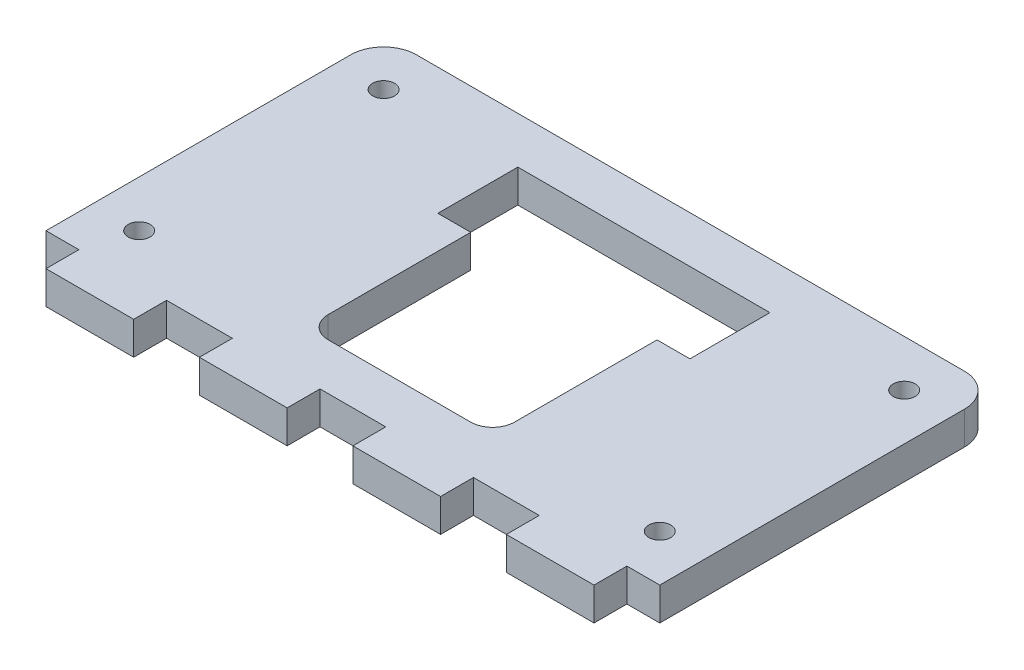
ISO-10303-21;
HEADER;
FILE_DESCRIPTION(('STEP AP214'),'2;1');
FILE_NAME('part.step','',(''),(''),'','','');
FILE_SCHEMA(('AUTOMOTIVE_DESIGN { 1 0 10303 214 1 1 1 1 }'));
ENDSEC;
DATA;
#1=APPLICATION_CONTEXT('core data for automotive mechanical design processes');
#2=APPLICATION_PROTOCOL_DEFINITION('international standard','automotive_design',2000,#1);
#3=PRODUCT_CONTEXT('',#1,'mechanical');
#4=PRODUCT('Part','Part','',(#3));
#5=PRODUCT_RELATED_PRODUCT_CATEGORY('part','',(#4));
#6=PRODUCT_DEFINITION_FORMATION('','',#4);
#7=PRODUCT_DEFINITION_CONTEXT('part definition',#1,'design');
#8=PRODUCT_DEFINITION('design','',#6,#7);
#9=PRODUCT_DEFINITION_SHAPE('','',#8);
#10=(LENGTH_UNIT() NAMED_UNIT(*) SI_UNIT(.MILLI.,.METRE.));
#11=(NAMED_UNIT(*) PLANE_ANGLE_UNIT() SI_UNIT($,.RADIAN.));
#12=(NAMED_UNIT(*) SI_UNIT($,.STERADIAN.) SOLID_ANGLE_UNIT());
#13=UNCERTAINTY_MEASURE_WITH_UNIT(LENGTH_MEASURE(1.E-05),#10,'distance_accuracy_value','');
#14=(GEOMETRIC_REPRESENTATION_CONTEXT(3) GLOBAL_UNCERTAINTY_ASSIGNED_CONTEXT((#13)) GLOBAL_UNIT_ASSIGNED_CONTEXT((#10,
#11,#12)) REPRESENTATION_CONTEXT('',''));
#15=CARTESIAN_POINT('',(0.,0.,0.));
#16=DIRECTION('',(0.,0.,1.));
#17=DIRECTION('',(1.,0.,0.));
#18=AXIS2_PLACEMENT_3D('',#15,#16,#17);
#19=CARTESIAN_POINT('',(25.,3.,2.99999999999999));
#20=DIRECTION('',(0.,-1.,0.));
#21=DIRECTION('',(0.,0.,-1.));
#22=AXIS2_PLACEMENT_3D('',#19,#20,#21);
#23=PLANE('',#22);
#24=CARTESIAN_POINT('',(23.75,3.,4.24999999999999));
#25=DIRECTION('',(0.,1.,0.));
#26=DIRECTION('',(0.,0.,1.));
#27=AXIS2_PLACEMENT_3D('',#24,#25,#26);
#28=CIRCLE('',#27,1.);
#29=CARTESIAN_POINT('',(23.75,3.,5.25));
#30=VERTEX_POINT('',#29);
#31=EDGE_CURVE('E321',#30,#30,#28,.T.);
#32=ORIENTED_EDGE('',*,*,#31,.F.);
#33=EDGE_LOOP('',(#32));
#34=FACE_BOUND('',#33,.T.);
#35=CARTESIAN_POINT('',(23.75,3.,26.55));
#36=DIRECTION('',(0.,1.,0.));
#37=DIRECTION('',(0.,0.,1.));
#38=AXIS2_PLACEMENT_3D('',#35,#36,#37);
#39=CIRCLE('',#38,1.00000000000001);
#40=CARTESIAN_POINT('',(23.75,3.,27.55));
#41=VERTEX_POINT('',#40);
#42=EDGE_CURVE('E327',#41,#41,#39,.T.);
#43=ORIENTED_EDGE('',*,*,#42,.F.);
#44=EDGE_LOOP('',(#43));
#45=FACE_BOUND('',#44,.T.);
#46=CARTESIAN_POINT('',(-23.75,3.,26.55));
#47=DIRECTION('',(0.,1.,0.));
#48=DIRECTION('',(0.,0.,1.));
#49=AXIS2_PLACEMENT_3D('',#46,#47,#48);
#50=CIRCLE('',#49,0.999999999999998);
#51=CARTESIAN_POINT('',(-23.75,3.,27.55));
#52=VERTEX_POINT('',#51);
#53=EDGE_CURVE('E333',#52,#52,#50,.T.);
#54=ORIENTED_EDGE('',*,*,#53,.F.);
#55=EDGE_LOOP('',(#54));
#56=FACE_BOUND('',#55,.T.);
#57=CARTESIAN_POINT('',(-23.75,3.,4.25));
#58=DIRECTION('',(0.,1.,0.));
#59=DIRECTION('',(0.,0.,1.));
#60=AXIS2_PLACEMENT_3D('',#57,#58,#59);
#61=CIRCLE('',#60,0.999999999999998);
#62=CARTESIAN_POINT('',(-23.75,3.,5.25));
#63=VERTEX_POINT('',#62);
#64=EDGE_CURVE('E339',#63,#63,#61,.T.);
#65=ORIENTED_EDGE('',*,*,#64,.F.);
#66=EDGE_LOOP('',(#65));
#67=FACE_BOUND('',#66,.T.);
#68=DIRECTION('',(0.,0.,1.));
#69=VECTOR('',#68,1.);
#70=CARTESIAN_POINT('',(-28.,3.,3.));
#71=LINE('',#70,#69);
#72=CARTESIAN_POINT('',(-28.,3.,3.));
#73=VERTEX_POINT('',#72);
#74=CARTESIAN_POINT('',(-28.,3.,30.8));
#75=VERTEX_POINT('',#74);
#76=EDGE_CURVE('E345',#73,#75,#71,.T.);
#77=ORIENTED_EDGE('',*,*,#76,.T.);
#78=DIRECTION('',(1.,0.,0.));
#79=VECTOR('',#78,1.);
#80=CARTESIAN_POINT('',(-28.,3.,30.8));
#81=LINE('',#80,#79);
#82=CARTESIAN_POINT('',(-25.,3.,30.8));
#83=VERTEX_POINT('',#82);
#84=EDGE_CURVE('E348',#75,#83,#81,.T.);
#85=ORIENTED_EDGE('',*,*,#84,.T.);
#86=DIRECTION('',(0.,0.,1.));
#87=VECTOR('',#86,1.);
#88=CARTESIAN_POINT('',(-25.,3.,30.8));
#89=LINE('',#88,#87);
#90=CARTESIAN_POINT('',(-25.,3.,33.8));
#91=VERTEX_POINT('',#90);
#92=EDGE_CURVE('E351',#83,#91,#89,.T.);
#93=ORIENTED_EDGE('',*,*,#92,.T.);
#94=DIRECTION('',(1.,0.,0.));
#95=VECTOR('',#94,1.);
#96=CARTESIAN_POINT('',(-25.,3.,33.8));
#97=LINE('',#96,#95);
#98=CARTESIAN_POINT('',(-17.,3.,33.8));
#99=VERTEX_POINT('',#98);
#100=EDGE_CURVE('E353',#91,#99,#97,.T.);
#101=ORIENTED_EDGE('',*,*,#100,.T.);
#102=DIRECTION('',(0.,0.,-1.));
#103=VECTOR('',#102,1.);
#104=CARTESIAN_POINT('',(-17.,3.,33.8));
#105=LINE('',#104,#103);
#106=CARTESIAN_POINT('',(-17.,3.,30.8));
#107=VERTEX_POINT('',#106);
#108=EDGE_CURVE('E355',#99,#107,#105,.T.);
#109=ORIENTED_EDGE('',*,*,#108,.T.);
#110=DIRECTION('',(1.,0.,0.));
#111=VECTOR('',#110,1.);
#112=CARTESIAN_POINT('',(-17.,3.,30.8));
#113=LINE('',#112,#111);
#114=CARTESIAN_POINT('',(-11.,3.,30.8));
#115=VERTEX_POINT('',#114);
#116=EDGE_CURVE('E357',#107,#115,#113,.T.);
#117=ORIENTED_EDGE('',*,*,#116,.T.);
#118=DIRECTION('',(0.,0.,1.));
#119=VECTOR('',#118,1.);
#120=CARTESIAN_POINT('',(-11.,3.,30.8));
#121=LINE('',#120,#119);
#122=CARTESIAN_POINT('',(-11.,3.,33.8));
#123=VERTEX_POINT('',#122);
#124=EDGE_CURVE('E359',#115,#123,#121,.T.);
#125=ORIENTED_EDGE('',*,*,#124,.T.);
#126=DIRECTION('',(1.,0.,0.));
#127=VECTOR('',#126,1.);
#128=CARTESIAN_POINT('',(-11.,3.,33.8));
#129=LINE('',#128,#127);
#130=CARTESIAN_POINT('',(-3.,3.,33.8));
#131=VERTEX_POINT('',#130);
#132=EDGE_CURVE('E361',#123,#131,#129,.T.);
#133=ORIENTED_EDGE('',*,*,#132,.T.);
#134=DIRECTION('',(0.,0.,-1.));
#135=VECTOR('',#134,1.);
#136=CARTESIAN_POINT('',(-3.,3.,33.8));
#137=LINE('',#136,#135);
#138=CARTESIAN_POINT('',(-3.,3.,30.8));
#139=VERTEX_POINT('',#138);
#140=EDGE_CURVE('E363',#131,#139,#137,.T.);
#141=ORIENTED_EDGE('',*,*,#140,.T.);
#142=DIRECTION('',(1.,0.,0.));
#143=VECTOR('',#142,1.);
#144=CARTESIAN_POINT('',(-3.,3.,30.8));
#145=LINE('',#144,#143);
#146=CARTESIAN_POINT('',(3.,3.,30.8));
#147=VERTEX_POINT('',#146);
#148=EDGE_CURVE('E365',#139,#147,#145,.T.);
#149=ORIENTED_EDGE('',*,*,#148,.T.);
#150=DIRECTION('',(0.,0.,1.));
#151=VECTOR('',#150,1.);
#152=CARTESIAN_POINT('',(3.,3.,30.8));
#153=LINE('',#152,#151);
#154=CARTESIAN_POINT('',(3.,3.,33.8));
#155=VERTEX_POINT('',#154);
#156=EDGE_CURVE('E367',#147,#155,#153,.T.);
#157=ORIENTED_EDGE('',*,*,#156,.T.);
#158=DIRECTION('',(1.,0.,0.));
#159=VECTOR('',#158,1.);
#160=CARTESIAN_POINT('',(3.,3.,33.8));
#161=LINE('',#160,#159);
#162=CARTESIAN_POINT('',(11.,3.,33.8));
#163=VERTEX_POINT('',#162);
#164=EDGE_CURVE('E369',#155,#163,#161,.T.);
#165=ORIENTED_EDGE('',*,*,#164,.T.);
#166=DIRECTION('',(0.,0.,-1.));
#167=VECTOR('',#166,1.);
#168=CARTESIAN_POINT('',(11.,3.,33.8));
#169=LINE('',#168,#167);
#170=CARTESIAN_POINT('',(11.,3.,30.8));
#171=VERTEX_POINT('',#170);
#172=EDGE_CURVE('E371',#163,#171,#169,.T.);
#173=ORIENTED_EDGE('',*,*,#172,.T.);
#174=DIRECTION('',(1.,0.,0.));
#175=VECTOR('',#174,1.);
#176=CARTESIAN_POINT('',(11.,3.,30.8));
#177=LINE('',#176,#175);
#178=CARTESIAN_POINT('',(17.,3.,30.8));
#179=VERTEX_POINT('',#178);
#180=EDGE_CURVE('E373',#171,#179,#177,.T.);
#181=ORIENTED_EDGE('',*,*,#180,.T.);
#182=DIRECTION('',(0.,0.,1.));
#183=VECTOR('',#182,1.);
#184=CARTESIAN_POINT('',(17.,3.,30.8));
#185=LINE('',#184,#183);
#186=CARTESIAN_POINT('',(17.,3.,33.8));
#187=VERTEX_POINT('',#186);
#188=EDGE_CURVE('E375',#179,#187,#185,.T.);
#189=ORIENTED_EDGE('',*,*,#188,.T.);
#190=DIRECTION('',(1.,0.,0.));
#191=VECTOR('',#190,1.);
#192=CARTESIAN_POINT('',(17.,3.,33.8));
#193=LINE('',#192,#191);
#194=CARTESIAN_POINT('',(25.,3.,33.8));
#195=VERTEX_POINT('',#194);
#196=EDGE_CURVE('E377',#187,#195,#193,.T.);
#197=ORIENTED_EDGE('',*,*,#196,.T.);
#198=DIRECTION('',(0.,0.,-1.));
#199=VECTOR('',#198,1.);
#200=CARTESIAN_POINT('',(25.,3.,33.8));
#201=LINE('',#200,#199);
#202=CARTESIAN_POINT('',(25.,3.,30.8));
#203=VERTEX_POINT('',#202);
#204=EDGE_CURVE('E379',#195,#203,#201,.T.);
#205=ORIENTED_EDGE('',*,*,#204,.T.);
#206=DIRECTION('',(1.,0.,0.));
#207=VECTOR('',#206,1.);
#208=CARTESIAN_POINT('',(25.,3.,30.8));
#209=LINE('',#208,#207);
#210=CARTESIAN_POINT('',(28.,3.,30.8));
#211=VERTEX_POINT('',#210);
#212=EDGE_CURVE('E381',#203,#211,#209,.T.);
#213=ORIENTED_EDGE('',*,*,#212,.T.);
#214=DIRECTION('',(0.,0.,-1.));
#215=VECTOR('',#214,1.);
#216=CARTESIAN_POINT('',(28.,3.,2.99999999999999));
#217=LINE('',#216,#215);
#218=CARTESIAN_POINT('',(28.,3.,2.99999999999999));
#219=VERTEX_POINT('',#218);
#220=EDGE_CURVE('E383',#211,#219,#217,.T.);
#221=ORIENTED_EDGE('',*,*,#220,.T.);
#222=CARTESIAN_POINT('',(25.,3.,2.99999999999999));
#223=DIRECTION('',(0.,1.,0.));
#224=DIRECTION('',(0.,0.,-1.));
#225=AXIS2_PLACEMENT_3D('',#222,#223,#224);
#226=CIRCLE('',#225,3.);
#227=CARTESIAN_POINT('',(25.,3.,0.));
#228=VERTEX_POINT('',#227);
#229=EDGE_CURVE('E385',#219,#228,#226,.T.);
#230=ORIENTED_EDGE('',*,*,#229,.T.);
#231=DIRECTION('',(-1.,0.,0.));
#232=VECTOR('',#231,1.);
#233=CARTESIAN_POINT('',(-25.,3.,0.));
#234=LINE('',#233,#232);
#235=CARTESIAN_POINT('',(-25.,3.,0.));
#236=VERTEX_POINT('',#235);
#237=EDGE_CURVE('E387',#228,#236,#234,.T.);
#238=ORIENTED_EDGE('',*,*,#237,.T.);
#239=CARTESIAN_POINT('',(-25.,3.,3.));
#240=DIRECTION('',(0.,1.,0.));
#241=DIRECTION('',(0.,0.,1.));
#242=AXIS2_PLACEMENT_3D('',#239,#240,#241);
#243=CIRCLE('',#242,3.);
#244=EDGE_CURVE('E389',#236,#73,#243,.T.);
#245=ORIENTED_EDGE('',*,*,#244,.T.);
#246=EDGE_LOOP('',(#77,#85,#93,#101,#109,#117,#125,#133,#141,#149,#157,#165,#173,#181,#189,#197,
#205,#213,#221,#230,#238,#245));
#247=FACE_BOUND('',#246,.T.);
#248=DIRECTION('',(0.,0.,-1.));
#249=VECTOR('',#248,1.);
#250=CARTESIAN_POINT('',(11.5,3.,11.55));
#251=LINE('',#250,#249);
#252=CARTESIAN_POINT('',(11.5,3.,11.55));
#253=VERTEX_POINT('',#252);
#254=CARTESIAN_POINT('',(11.5,3.,4.25));
#255=VERTEX_POINT('',#254);
#256=EDGE_CURVE('E242',#253,#255,#251,.T.);
#257=ORIENTED_EDGE('',*,*,#256,.F.);
#258=DIRECTION('',(1.,0.,0.));
#259=VECTOR('',#258,1.);
#260=CARTESIAN_POINT('',(11.5,3.,11.55));
#261=LINE('',#260,#259);
#262=CARTESIAN_POINT('',(8.5,3.,11.55));
#263=VERTEX_POINT('',#262);
#264=EDGE_CURVE('E279',#263,#253,#261,.T.);
#265=ORIENTED_EDGE('',*,*,#264,.F.);
#266=DIRECTION('',(0.,0.,-1.));
#267=VECTOR('',#266,1.);
#268=CARTESIAN_POINT('',(8.5,3.,11.55));
#269=LINE('',#268,#267);
#270=CARTESIAN_POINT('',(8.5,3.,24.55));
#271=VERTEX_POINT('',#270);
#272=EDGE_CURVE('E277',#271,#263,#269,.T.);
#273=ORIENTED_EDGE('',*,*,#272,.F.);
#274=CARTESIAN_POINT('',(6.50000000000001,3.,24.55));
#275=DIRECTION('',(0.,1.,0.));
#276=DIRECTION('',(0.,0.,-1.));
#277=AXIS2_PLACEMENT_3D('',#274,#275,#276);
#278=CIRCLE('',#277,2.);
#279=CARTESIAN_POINT('',(6.50000000000001,3.,26.55));
#280=VERTEX_POINT('',#279);
#281=EDGE_CURVE('E275',#280,#271,#278,.T.);
#282=ORIENTED_EDGE('',*,*,#281,.F.);
#283=DIRECTION('',(1.,0.,0.));
#284=VECTOR('',#283,1.);
#285=CARTESIAN_POINT('',(-6.49999999999998,3.,26.55));
#286=LINE('',#285,#284);
#287=CARTESIAN_POINT('',(-6.5,3.,26.55));
#288=VERTEX_POINT('',#287);
#289=EDGE_CURVE('E273',#288,#280,#286,.T.);
#290=ORIENTED_EDGE('',*,*,#289,.F.);
#291=CARTESIAN_POINT('',(-6.5,3.,24.55));
#292=DIRECTION('',(0.,1.,0.));
#293=DIRECTION('',(0.,0.,1.));
#294=AXIS2_PLACEMENT_3D('',#291,#292,#293);
#295=CIRCLE('',#294,2.);
#296=CARTESIAN_POINT('',(-8.5,3.,24.55));
#297=VERTEX_POINT('',#296);
#298=EDGE_CURVE('E271',#297,#288,#295,.T.);
#299=ORIENTED_EDGE('',*,*,#298,.F.);
#300=DIRECTION('',(0.,0.,1.));
#301=VECTOR('',#300,1.);
#302=CARTESIAN_POINT('',(-8.5,3.,11.55));
#303=LINE('',#302,#301);
#304=CARTESIAN_POINT('',(-8.5,3.,11.55));
#305=VERTEX_POINT('',#304);
#306=EDGE_CURVE('E269',#305,#297,#303,.T.);
#307=ORIENTED_EDGE('',*,*,#306,.F.);
#308=DIRECTION('',(1.,0.,0.));
#309=VECTOR('',#308,1.);
#310=CARTESIAN_POINT('',(-11.5,3.,11.55));
#311=LINE('',#310,#309);
#312=CARTESIAN_POINT('',(-11.5,3.,11.55));
#313=VERTEX_POINT('',#312);
#314=EDGE_CURVE('E265',#313,#305,#311,.T.);
#315=ORIENTED_EDGE('',*,*,#314,.F.);
#316=DIRECTION('',(0.,0.,1.));
#317=VECTOR('',#316,1.);
#318=CARTESIAN_POINT('',(-11.5,3.,11.55));
#319=LINE('',#318,#317);
#320=CARTESIAN_POINT('',(-11.5,3.,4.25));
#321=VERTEX_POINT('',#320);
#322=EDGE_CURVE('E263',#321,#313,#319,.T.);
#323=ORIENTED_EDGE('',*,*,#322,.F.);
#324=DIRECTION('',(-1.,0.,0.));
#325=VECTOR('',#324,1.);
#326=CARTESIAN_POINT('',(-11.5,3.,4.25));
#327=LINE('',#326,#325);
#328=EDGE_CURVE('E250',#255,#321,#327,.T.);
#329=ORIENTED_EDGE('',*,*,#328,.F.);
#330=EDGE_LOOP('',(#257,#265,#273,#282,#290,#299,#307,#315,#323,#329));
#331=FACE_BOUND('',#330,.T.);
#332=ADVANCED_FACE('F33',(#34,#45,#56,#67,#247,#331),#23,.F.);
#333=CARTESIAN_POINT('',(25.,0.,2.99999999999999));
#334=DIRECTION('',(0.,-1.,0.));
#335=DIRECTION('',(0.,0.,-1.));
#336=AXIS2_PLACEMENT_3D('',#333,#334,#335);
#337=PLANE('',#336);
#338=CARTESIAN_POINT('',(23.75,0.,26.55));
#339=DIRECTION('',(0.,1.,0.));
#340=DIRECTION('',(0.,0.,1.));
#341=AXIS2_PLACEMENT_3D('',#338,#339,#340);
#342=CIRCLE('',#341,1.00000000000001);
#343=CARTESIAN_POINT('',(23.75,0.,27.55));
#344=VERTEX_POINT('',#343);
#345=EDGE_CURVE('E324',#344,#344,#342,.T.);
#346=ORIENTED_EDGE('',*,*,#345,.T.);
#347=EDGE_LOOP('',(#346));
#348=FACE_BOUND('',#347,.T.);
#349=CARTESIAN_POINT('',(-23.75,0.,4.25));
#350=DIRECTION('',(0.,1.,0.));
#351=DIRECTION('',(0.,0.,1.));
#352=AXIS2_PLACEMENT_3D('',#349,#350,#351);
#353=CIRCLE('',#352,0.999999999999998);
#354=CARTESIAN_POINT('',(-23.75,0.,5.25));
#355=VERTEX_POINT('',#354);
#356=EDGE_CURVE('E336',#355,#355,#353,.T.);
#357=ORIENTED_EDGE('',*,*,#356,.T.);
#358=EDGE_LOOP('',(#357));
#359=FACE_BOUND('',#358,.T.);
#360=DIRECTION('',(0.,0.,1.));
#361=VECTOR('',#360,1.);
#362=CARTESIAN_POINT('',(-28.,0.,3.));
#363=LINE('',#362,#361);
#364=CARTESIAN_POINT('',(-28.,0.,3.));
#365=VERTEX_POINT('',#364);
#366=CARTESIAN_POINT('',(-28.,0.,30.8));
#367=VERTEX_POINT('',#366);
#368=EDGE_CURVE('E342',#365,#367,#363,.T.);
#369=ORIENTED_EDGE('',*,*,#368,.F.);
#370=CARTESIAN_POINT('',(-25.,0.,3.));
#371=DIRECTION('',(0.,1.,0.));
#372=DIRECTION('',(0.,0.,1.));
#373=AXIS2_PLACEMENT_3D('',#370,#371,#372);
#374=CIRCLE('',#373,3.);
#375=CARTESIAN_POINT('',(-25.,0.,0.));
#376=VERTEX_POINT('',#375);
#377=EDGE_CURVE('E349',#376,#365,#374,.T.);
#378=ORIENTED_EDGE('',*,*,#377,.F.);
#379=DIRECTION('',(-1.,0.,0.));
#380=VECTOR('',#379,1.);
#381=CARTESIAN_POINT('',(-25.,0.,0.));
#382=LINE('',#381,#380);
#383=CARTESIAN_POINT('',(25.,0.,0.));
#384=VERTEX_POINT('',#383);
#385=EDGE_CURVE('E432',#384,#376,#382,.T.);
#386=ORIENTED_EDGE('',*,*,#385,.F.);
#387=CARTESIAN_POINT('',(25.,0.,2.99999999999999));
#388=DIRECTION('',(0.,1.,0.));
#389=DIRECTION('',(0.,0.,-1.));
#390=AXIS2_PLACEMENT_3D('',#387,#388,#389);
#391=CIRCLE('',#390,3.);
#392=CARTESIAN_POINT('',(28.,0.,2.99999999999999));
#393=VERTEX_POINT('',#392);
#394=EDGE_CURVE('E430',#393,#384,#391,.T.);
#395=ORIENTED_EDGE('',*,*,#394,.F.);
#396=DIRECTION('',(0.,0.,-1.));
#397=VECTOR('',#396,1.);
#398=CARTESIAN_POINT('',(28.,0.,2.99999999999999));
#399=LINE('',#398,#397);
#400=CARTESIAN_POINT('',(28.,0.,30.8));
#401=VERTEX_POINT('',#400);
#402=EDGE_CURVE('E428',#401,#393,#399,.T.);
#403=ORIENTED_EDGE('',*,*,#402,.F.);
#404=DIRECTION('',(1.,0.,0.));
#405=VECTOR('',#404,1.);
#406=CARTESIAN_POINT('',(25.,0.,30.8));
#407=LINE('',#406,#405);
#408=CARTESIAN_POINT('',(25.,0.,30.8));
#409=VERTEX_POINT('',#408);
#410=EDGE_CURVE('E426',#409,#401,#407,.T.);
#411=ORIENTED_EDGE('',*,*,#410,.F.);
#412=DIRECTION('',(0.,0.,-1.));
#413=VECTOR('',#412,1.);
#414=CARTESIAN_POINT('',(25.,0.,33.8));
#415=LINE('',#414,#413);
#416=CARTESIAN_POINT('',(25.,0.,33.8));
#417=VERTEX_POINT('',#416);
#418=EDGE_CURVE('E424',#417,#409,#415,.T.);
#419=ORIENTED_EDGE('',*,*,#418,.F.);
#420=DIRECTION('',(1.,0.,0.));
#421=VECTOR('',#420,1.);
#422=CARTESIAN_POINT('',(17.,0.,33.8));
#423=LINE('',#422,#421);
#424=CARTESIAN_POINT('',(17.,0.,33.8));
#425=VERTEX_POINT('',#424);
#426=EDGE_CURVE('E422',#425,#417,#423,.T.);
#427=ORIENTED_EDGE('',*,*,#426,.F.);
#428=DIRECTION('',(0.,0.,1.));
#429=VECTOR('',#428,1.);
#430=CARTESIAN_POINT('',(17.,0.,30.8));
#431=LINE('',#430,#429);
#432=CARTESIAN_POINT('',(17.,0.,30.8));
#433=VERTEX_POINT('',#432);
#434=EDGE_CURVE('E420',#433,#425,#431,.T.);
#435=ORIENTED_EDGE('',*,*,#434,.F.);
#436=DIRECTION('',(1.,0.,0.));
#437=VECTOR('',#436,1.);
#438=CARTESIAN_POINT('',(11.,0.,30.8));
#439=LINE('',#438,#437);
#440=CARTESIAN_POINT('',(11.,0.,30.8));
#441=VERTEX_POINT('',#440);
#442=EDGE_CURVE('E418',#441,#433,#439,.T.);
#443=ORIENTED_EDGE('',*,*,#442,.F.);
#444=DIRECTION('',(0.,0.,-1.));
#445=VECTOR('',#444,1.);
#446=CARTESIAN_POINT('',(11.,0.,33.8));
#447=LINE('',#446,#445);
#448=CARTESIAN_POINT('',(11.,0.,33.8));
#449=VERTEX_POINT('',#448);
#450=EDGE_CURVE('E416',#449,#441,#447,.T.);
#451=ORIENTED_EDGE('',*,*,#450,.F.);
#452=DIRECTION('',(1.,0.,0.));
#453=VECTOR('',#452,1.);
#454=CARTESIAN_POINT('',(3.,0.,33.8));
#455=LINE('',#454,#453);
#456=CARTESIAN_POINT('',(3.,0.,33.8));
#457=VERTEX_POINT('',#456);
#458=EDGE_CURVE('E414',#457,#449,#455,.T.);
#459=ORIENTED_EDGE('',*,*,#458,.F.);
#460=DIRECTION('',(0.,0.,1.));
#461=VECTOR('',#460,1.);
#462=CARTESIAN_POINT('',(3.,0.,30.8));
#463=LINE('',#462,#461);
#464=CARTESIAN_POINT('',(3.,0.,30.8));
#465=VERTEX_POINT('',#464);
#466=EDGE_CURVE('E412',#465,#457,#463,.T.);
#467=ORIENTED_EDGE('',*,*,#466,.F.);
#468=DIRECTION('',(1.,0.,0.));
#469=VECTOR('',#468,1.);
#470=CARTESIAN_POINT('',(-3.,0.,30.8));
#471=LINE('',#470,#469);
#472=CARTESIAN_POINT('',(-3.,0.,30.8));
#473=VERTEX_POINT('',#472);
#474=EDGE_CURVE('E410',#473,#465,#471,.T.);
#475=ORIENTED_EDGE('',*,*,#474,.F.);
#476=DIRECTION('',(0.,0.,-1.));
#477=VECTOR('',#476,1.);
#478=CARTESIAN_POINT('',(-3.,0.,33.8));
#479=LINE('',#478,#477);
#480=CARTESIAN_POINT('',(-3.,0.,33.8));
#481=VERTEX_POINT('',#480);
#482=EDGE_CURVE('E408',#481,#473,#479,.T.);
#483=ORIENTED_EDGE('',*,*,#482,.F.);
#484=DIRECTION('',(1.,0.,0.));
#485=VECTOR('',#484,1.);
#486=CARTESIAN_POINT('',(-11.,0.,33.8));
#487=LINE('',#486,#485);
#488=CARTESIAN_POINT('',(-11.,0.,33.8));
#489=VERTEX_POINT('',#488);
#490=EDGE_CURVE('E406',#489,#481,#487,.T.);
#491=ORIENTED_EDGE('',*,*,#490,.F.);
#492=DIRECTION('',(0.,0.,1.));
#493=VECTOR('',#492,1.);
#494=CARTESIAN_POINT('',(-11.,0.,30.8));
#495=LINE('',#494,#493);
#496=CARTESIAN_POINT('',(-11.,0.,30.8));
#497=VERTEX_POINT('',#496);
#498=EDGE_CURVE('E404',#497,#489,#495,.T.);
#499=ORIENTED_EDGE('',*,*,#498,.F.);
#500=DIRECTION('',(1.,0.,0.));
#501=VECTOR('',#500,1.);
#502=CARTESIAN_POINT('',(-17.,0.,30.8));
#503=LINE('',#502,#501);
#504=CARTESIAN_POINT('',(-17.,0.,30.8));
#505=VERTEX_POINT('',#504);
#506=EDGE_CURVE('E402',#505,#497,#503,.T.);
#507=ORIENTED_EDGE('',*,*,#506,.F.);
#508=DIRECTION('',(0.,0.,-1.));
#509=VECTOR('',#508,1.);
#510=CARTESIAN_POINT('',(-17.,0.,33.8));
#511=LINE('',#510,#509);
#512=CARTESIAN_POINT('',(-17.,0.,33.8));
#513=VERTEX_POINT('',#512);
#514=EDGE_CURVE('E400',#513,#505,#511,.T.);
#515=ORIENTED_EDGE('',*,*,#514,.F.);
#516=DIRECTION('',(1.,0.,0.));
#517=VECTOR('',#516,1.);
#518=CARTESIAN_POINT('',(-25.,0.,33.8));
#519=LINE('',#518,#517);
#520=CARTESIAN_POINT('',(-25.,0.,33.8));
#521=VERTEX_POINT('',#520);
#522=EDGE_CURVE('E398',#521,#513,#519,.T.);
#523=ORIENTED_EDGE('',*,*,#522,.F.);
#524=DIRECTION('',(0.,0.,1.));
#525=VECTOR('',#524,1.);
#526=CARTESIAN_POINT('',(-25.,0.,30.8));
#527=LINE('',#526,#525);
#528=CARTESIAN_POINT('',(-25.,0.,30.8));
#529=VERTEX_POINT('',#528);
#530=EDGE_CURVE('E396',#529,#521,#527,.T.);
#531=ORIENTED_EDGE('',*,*,#530,.F.);
#532=DIRECTION('',(1.,0.,0.));
#533=VECTOR('',#532,1.);
#534=CARTESIAN_POINT('',(-28.,0.,30.8));
#535=LINE('',#534,#533);
#536=EDGE_CURVE('E394',#367,#529,#535,.T.);
#537=ORIENTED_EDGE('',*,*,#536,.F.);
#538=EDGE_LOOP('',(#369,#378,#386,#395,#403,#411,#419,#427,#435,#443,#451,#459,#467,#475,#483,
#491,#499,#507,#515,#523,#531,#537));
#539=FACE_BOUND('',#538,.T.);
#540=CARTESIAN_POINT('',(-23.75,0.,26.55));
#541=DIRECTION('',(0.,1.,0.));
#542=DIRECTION('',(0.,0.,1.));
#543=AXIS2_PLACEMENT_3D('',#540,#541,#542);
#544=CIRCLE('',#543,0.999999999999998);
#545=CARTESIAN_POINT('',(-23.75,0.,27.55));
#546=VERTEX_POINT('',#545);
#547=EDGE_CURVE('E330',#546,#546,#544,.T.);
#548=ORIENTED_EDGE('',*,*,#547,.T.);
#549=EDGE_LOOP('',(#548));
#550=FACE_BOUND('',#549,.T.);
#551=CARTESIAN_POINT('',(23.75,0.,4.24999999999999));
#552=DIRECTION('',(0.,1.,0.));
#553=DIRECTION('',(0.,0.,1.));
#554=AXIS2_PLACEMENT_3D('',#551,#552,#553);
#555=CIRCLE('',#554,1.);
#556=CARTESIAN_POINT('',(23.75,0.,5.25));
#557=VERTEX_POINT('',#556);
#558=EDGE_CURVE('E258',#557,#557,#555,.T.);
#559=ORIENTED_EDGE('',*,*,#558,.T.);
#560=EDGE_LOOP('',(#559));
#561=FACE_BOUND('',#560,.T.);
#562=DIRECTION('',(1.,0.,0.));
#563=VECTOR('',#562,1.);
#564=CARTESIAN_POINT('',(11.5,0.,11.55));
#565=LINE('',#564,#563);
#566=CARTESIAN_POINT('',(8.5,0.,11.55));
#567=VERTEX_POINT('',#566);
#568=CARTESIAN_POINT('',(11.5,0.,11.55));
#569=VERTEX_POINT('',#568);
#570=EDGE_CURVE('E251',#567,#569,#565,.T.);
#571=ORIENTED_EDGE('',*,*,#570,.T.);
#572=DIRECTION('',(0.,0.,-1.));
#573=VECTOR('',#572,1.);
#574=CARTESIAN_POINT('',(11.5,0.,11.55));
#575=LINE('',#574,#573);
#576=CARTESIAN_POINT('',(11.5,0.,4.25));
#577=VERTEX_POINT('',#576);
#578=EDGE_CURVE('E56',#569,#577,#575,.T.);
#579=ORIENTED_EDGE('',*,*,#578,.T.);
#580=DIRECTION('',(-1.,0.,0.));
#581=VECTOR('',#580,1.);
#582=CARTESIAN_POINT('',(-11.5,0.,4.25));
#583=LINE('',#582,#581);
#584=CARTESIAN_POINT('',(-11.5,0.,4.25));
#585=VERTEX_POINT('',#584);
#586=EDGE_CURVE('E257',#577,#585,#583,.T.);
#587=ORIENTED_EDGE('',*,*,#586,.T.);
#588=DIRECTION('',(0.,0.,1.));
#589=VECTOR('',#588,1.);
#590=CARTESIAN_POINT('',(-11.5,0.,11.55));
#591=LINE('',#590,#589);
#592=CARTESIAN_POINT('',(-11.5,0.,11.55));
#593=VERTEX_POINT('',#592);
#594=EDGE_CURVE('E283',#585,#593,#591,.T.);
#595=ORIENTED_EDGE('',*,*,#594,.T.);
#596=DIRECTION('',(1.,0.,0.));
#597=VECTOR('',#596,1.);
#598=CARTESIAN_POINT('',(-11.5,0.,11.55));
#599=LINE('',#598,#597);
#600=CARTESIAN_POINT('',(-8.5,0.,11.55));
#601=VERTEX_POINT('',#600);
#602=EDGE_CURVE('E286',#593,#601,#599,.T.);
#603=ORIENTED_EDGE('',*,*,#602,.T.);
#604=DIRECTION('',(0.,0.,1.));
#605=VECTOR('',#604,1.);
#606=CARTESIAN_POINT('',(-8.5,0.,11.55));
#607=LINE('',#606,#605);
#608=CARTESIAN_POINT('',(-8.5,0.,24.55));
#609=VERTEX_POINT('',#608);
#610=EDGE_CURVE('E289',#601,#609,#607,.T.);
#611=ORIENTED_EDGE('',*,*,#610,.T.);
#612=CARTESIAN_POINT('',(-6.5,0.,24.55));
#613=DIRECTION('',(0.,1.,0.));
#614=DIRECTION('',(0.,0.,1.));
#615=AXIS2_PLACEMENT_3D('',#612,#613,#614);
#616=CIRCLE('',#615,2.);
#617=CARTESIAN_POINT('',(-6.5,0.,26.55));
#618=VERTEX_POINT('',#617);
#619=EDGE_CURVE('E292',#609,#618,#616,.T.);
#620=ORIENTED_EDGE('',*,*,#619,.T.);
#621=DIRECTION('',(1.,0.,0.));
#622=VECTOR('',#621,1.);
#623=CARTESIAN_POINT('',(-6.49999999999998,0.,26.55));
#624=LINE('',#623,#622);
#625=CARTESIAN_POINT('',(6.50000000000001,0.,26.55));
#626=VERTEX_POINT('',#625);
#627=EDGE_CURVE('E295',#618,#626,#624,.T.);
#628=ORIENTED_EDGE('',*,*,#627,.T.);
#629=CARTESIAN_POINT('',(6.50000000000001,0.,24.55));
#630=DIRECTION('',(0.,1.,0.));
#631=DIRECTION('',(0.,0.,-1.));
#632=AXIS2_PLACEMENT_3D('',#629,#630,#631);
#633=CIRCLE('',#632,2.);
#634=CARTESIAN_POINT('',(8.5,0.,24.55));
#635=VERTEX_POINT('',#634);
#636=EDGE_CURVE('E298',#626,#635,#633,.T.);
#637=ORIENTED_EDGE('',*,*,#636,.T.);
#638=DIRECTION('',(0.,0.,-1.));
#639=VECTOR('',#638,1.);
#640=CARTESIAN_POINT('',(8.5,0.,11.55));
#641=LINE('',#640,#639);
#642=EDGE_CURVE('E301',#635,#567,#641,.T.);
#643=ORIENTED_EDGE('',*,*,#642,.T.);
#644=EDGE_LOOP('',(#571,#579,#587,#595,#603,#611,#620,#628,#637,#643));
#645=FACE_BOUND('',#644,.T.);
#646=ADVANCED_FACE('F504',(#348,#359,#539,#550,#561,#645),#337,.T.);
#647=CARTESIAN_POINT('',(-28.,3.,3.));
#648=DIRECTION('',(1.,0.,0.));
#649=DIRECTION('',(0.,0.,-1.));
#650=AXIS2_PLACEMENT_3D('',#647,#648,#649);
#651=PLANE('',#650);
#652=ORIENTED_EDGE('',*,*,#368,.T.);
#653=DIRECTION('',(0.,-1.,0.));
#654=VECTOR('',#653,1.);
#655=CARTESIAN_POINT('',(-28.,3.,30.8));
#656=LINE('',#655,#654);
#657=EDGE_CURVE('E11',#75,#367,#656,.T.);
#658=ORIENTED_EDGE('',*,*,#657,.F.);
#659=ORIENTED_EDGE('',*,*,#76,.F.);
#660=DIRECTION('',(0.,-1.,0.));
#661=VECTOR('',#660,1.);
#662=CARTESIAN_POINT('',(-28.,3.,3.));
#663=LINE('',#662,#661);
#664=EDGE_CURVE('E391',#73,#365,#663,.T.);
#665=ORIENTED_EDGE('',*,*,#664,.T.);
#666=EDGE_LOOP('',(#652,#658,#659,#665));
#667=FACE_BOUND('',#666,.T.);
#668=ADVANCED_FACE('F35',(#667),#651,.F.);
#669=CARTESIAN_POINT('',(-28.,3.,30.8));
#670=DIRECTION('',(0.,0.,-1.));
#671=DIRECTION('',(-1.,0.,0.));
#672=AXIS2_PLACEMENT_3D('',#669,#670,#671);
#673=PLANE('',#672);
#674=ORIENTED_EDGE('',*,*,#536,.T.);
#675=DIRECTION('',(0.,-1.,0.));
#676=VECTOR('',#675,1.);
#677=CARTESIAN_POINT('',(-25.,3.,30.8));
#678=LINE('',#677,#676);
#679=EDGE_CURVE('E41',#83,#529,#678,.T.);
#680=ORIENTED_EDGE('',*,*,#679,.F.);
#681=ORIENTED_EDGE('',*,*,#84,.F.);
#682=ORIENTED_EDGE('',*,*,#657,.T.);
#683=EDGE_LOOP('',(#674,#680,#681,#682));
#684=FACE_BOUND('',#683,.T.);
#685=ADVANCED_FACE('F521',(#684),#673,.F.);
#686=CARTESIAN_POINT('',(-25.,3.,30.8));
#687=DIRECTION('',(1.,0.,0.));
#688=DIRECTION('',(0.,0.,-1.));
#689=AXIS2_PLACEMENT_3D('',#686,#687,#688);
#690=PLANE('',#689);
#691=ORIENTED_EDGE('',*,*,#530,.T.);
#692=DIRECTION('',(0.,-1.,0.));
#693=VECTOR('',#692,1.);
#694=CARTESIAN_POINT('',(-25.,3.,33.8));
#695=LINE('',#694,#693);
#696=EDGE_CURVE('E491',#91,#521,#695,.T.);
#697=ORIENTED_EDGE('',*,*,#696,.F.);
#698=ORIENTED_EDGE('',*,*,#92,.F.);
#699=ORIENTED_EDGE('',*,*,#679,.T.);
#700=EDGE_LOOP('',(#691,#697,#698,#699));
#701=FACE_BOUND('',#700,.T.);
#702=ADVANCED_FACE('F498',(#701),#690,.F.);
#703=CARTESIAN_POINT('',(-25.,3.,33.8));
#704=DIRECTION('',(0.,0.,-1.));
#705=DIRECTION('',(-1.,0.,0.));
#706=AXIS2_PLACEMENT_3D('',#703,#704,#705);
#707=PLANE('',#706);
#708=ORIENTED_EDGE('',*,*,#522,.T.);
#709=DIRECTION('',(0.,-1.,0.));
#710=VECTOR('',#709,1.);
#711=CARTESIAN_POINT('',(-17.,3.,33.8));
#712=LINE('',#711,#710);
#713=EDGE_CURVE('E488',#99,#513,#712,.T.);
#714=ORIENTED_EDGE('',*,*,#713,.F.);
#715=ORIENTED_EDGE('',*,*,#100,.F.);
#716=ORIENTED_EDGE('',*,*,#696,.T.);
#717=EDGE_LOOP('',(#708,#714,#715,#716));
#718=FACE_BOUND('',#717,.T.);
#719=ADVANCED_FACE('F510',(#718),#707,.F.);
#720=CARTESIAN_POINT('',(-17.,3.,33.8));
#721=DIRECTION('',(-1.,0.,0.));
#722=DIRECTION('',(0.,0.,1.));
#723=AXIS2_PLACEMENT_3D('',#720,#721,#722);
#724=PLANE('',#723);
#725=ORIENTED_EDGE('',*,*,#514,.T.);
#726=DIRECTION('',(0.,-1.,0.));
#727=VECTOR('',#726,1.);
#728=CARTESIAN_POINT('',(-17.,3.,30.8));
#729=LINE('',#728,#727);
#730=EDGE_CURVE('E485',#107,#505,#729,.T.);
#731=ORIENTED_EDGE('',*,*,#730,.F.);
#732=ORIENTED_EDGE('',*,*,#108,.F.);
#733=ORIENTED_EDGE('',*,*,#713,.T.);
#734=EDGE_LOOP('',(#725,#731,#732,#733));
#735=FACE_BOUND('',#734,.T.);
#736=ADVANCED_FACE('F514',(#735),#724,.F.);
#737=CARTESIAN_POINT('',(-17.,3.,30.8));
#738=DIRECTION('',(0.,0.,-1.));
#739=DIRECTION('',(-1.,0.,0.));
#740=AXIS2_PLACEMENT_3D('',#737,#738,#739);
#741=PLANE('',#740);
#742=ORIENTED_EDGE('',*,*,#506,.T.);
#743=DIRECTION('',(0.,-1.,0.));
#744=VECTOR('',#743,1.);
#745=CARTESIAN_POINT('',(-11.,3.,30.8));
#746=LINE('',#745,#744);
#747=EDGE_CURVE('E482',#115,#497,#746,.T.);
#748=ORIENTED_EDGE('',*,*,#747,.F.);
#749=ORIENTED_EDGE('',*,*,#116,.F.);
#750=ORIENTED_EDGE('',*,*,#730,.T.);
#751=EDGE_LOOP('',(#742,#748,#749,#750));
#752=FACE_BOUND('',#751,.T.);
#753=ADVANCED_FACE('F604',(#752),#741,.F.);
#754=CARTESIAN_POINT('',(-11.,3.,30.8));
#755=DIRECTION('',(1.,0.,0.));
#756=DIRECTION('',(0.,0.,-1.));
#757=AXIS2_PLACEMENT_3D('',#754,#755,#756);
#758=PLANE('',#757);
#759=ORIENTED_EDGE('',*,*,#498,.T.);
#760=DIRECTION('',(0.,-1.,0.));
#761=VECTOR('',#760,1.);
#762=CARTESIAN_POINT('',(-11.,3.,33.8));
#763=LINE('',#762,#761);
#764=EDGE_CURVE('E479',#123,#489,#763,.T.);
#765=ORIENTED_EDGE('',*,*,#764,.F.);
#766=ORIENTED_EDGE('',*,*,#124,.F.);
#767=ORIENTED_EDGE('',*,*,#747,.T.);
#768=EDGE_LOOP('',(#759,#765,#766,#767));
#769=FACE_BOUND('',#768,.T.);
#770=ADVANCED_FACE('F601',(#769),#758,.F.);
#771=CARTESIAN_POINT('',(-11.,3.,33.8));
#772=DIRECTION('',(0.,0.,-1.));
#773=DIRECTION('',(-1.,0.,0.));
#774=AXIS2_PLACEMENT_3D('',#771,#772,#773);
#775=PLANE('',#774);
#776=ORIENTED_EDGE('',*,*,#490,.T.);
#777=DIRECTION('',(0.,-1.,0.));
#778=VECTOR('',#777,1.);
#779=CARTESIAN_POINT('',(-3.,3.,33.8));
#780=LINE('',#779,#778);
#781=EDGE_CURVE('E476',#131,#481,#780,.T.);
#782=ORIENTED_EDGE('',*,*,#781,.F.);
#783=ORIENTED_EDGE('',*,*,#132,.F.);
#784=ORIENTED_EDGE('',*,*,#764,.T.);
#785=EDGE_LOOP('',(#776,#782,#783,#784));
#786=FACE_BOUND('',#785,.T.);
#787=ADVANCED_FACE('F597',(#786),#775,.F.);
#788=CARTESIAN_POINT('',(-3.,3.,33.8));
#789=DIRECTION('',(-1.,0.,0.));
#790=DIRECTION('',(0.,0.,1.));
#791=AXIS2_PLACEMENT_3D('',#788,#789,#790);
#792=PLANE('',#791);
#793=ORIENTED_EDGE('',*,*,#482,.T.);
#794=DIRECTION('',(0.,-1.,0.));
#795=VECTOR('',#794,1.);
#796=CARTESIAN_POINT('',(-3.,3.,30.8));
#797=LINE('',#796,#795);
#798=EDGE_CURVE('E473',#139,#473,#797,.T.);
#799=ORIENTED_EDGE('',*,*,#798,.F.);
#800=ORIENTED_EDGE('',*,*,#140,.F.);
#801=ORIENTED_EDGE('',*,*,#781,.T.);
#802=EDGE_LOOP('',(#793,#799,#800,#801));
#803=FACE_BOUND('',#802,.T.);
#804=ADVANCED_FACE('F593',(#803),#792,.F.);
#805=CARTESIAN_POINT('',(-3.,3.,30.8));
#806=DIRECTION('',(0.,0.,-1.));
#807=DIRECTION('',(-1.,0.,0.));
#808=AXIS2_PLACEMENT_3D('',#805,#806,#807);
#809=PLANE('',#808);
#810=ORIENTED_EDGE('',*,*,#474,.T.);
#811=DIRECTION('',(0.,-1.,0.));
#812=VECTOR('',#811,1.);
#813=CARTESIAN_POINT('',(3.,3.,30.8));
#814=LINE('',#813,#812);
#815=EDGE_CURVE('E470',#147,#465,#814,.T.);
#816=ORIENTED_EDGE('',*,*,#815,.F.);
#817=ORIENTED_EDGE('',*,*,#148,.F.);
#818=ORIENTED_EDGE('',*,*,#798,.T.);
#819=EDGE_LOOP('',(#810,#816,#817,#818));
#820=FACE_BOUND('',#819,.T.);
#821=ADVANCED_FACE('F588',(#820),#809,.F.);
#822=CARTESIAN_POINT('',(3.,3.,30.8));
#823=DIRECTION('',(1.,0.,0.));
#824=DIRECTION('',(0.,0.,-1.));
#825=AXIS2_PLACEMENT_3D('',#822,#823,#824);
#826=PLANE('',#825);
#827=ORIENTED_EDGE('',*,*,#466,.T.);
#828=DIRECTION('',(0.,-1.,0.));
#829=VECTOR('',#828,1.);
#830=CARTESIAN_POINT('',(3.,3.,33.8));
#831=LINE('',#830,#829);
#832=EDGE_CURVE('E467',#155,#457,#831,.T.);
#833=ORIENTED_EDGE('',*,*,#832,.F.);
#834=ORIENTED_EDGE('',*,*,#156,.F.);
#835=ORIENTED_EDGE('',*,*,#815,.T.);
#836=EDGE_LOOP('',(#827,#833,#834,#835));
#837=FACE_BOUND('',#836,.T.);
#838=ADVANCED_FACE('F582',(#837),#826,.F.);
#839=CARTESIAN_POINT('',(3.,3.,33.8));
#840=DIRECTION('',(0.,0.,-1.));
#841=DIRECTION('',(-1.,0.,0.));
#842=AXIS2_PLACEMENT_3D('',#839,#840,#841);
#843=PLANE('',#842);
#844=ORIENTED_EDGE('',*,*,#458,.T.);
#845=DIRECTION('',(0.,-1.,0.));
#846=VECTOR('',#845,1.);
#847=CARTESIAN_POINT('',(11.,3.,33.8));
#848=LINE('',#847,#846);
#849=EDGE_CURVE('E464',#163,#449,#848,.T.);
#850=ORIENTED_EDGE('',*,*,#849,.F.);
#851=ORIENTED_EDGE('',*,*,#164,.F.);
#852=ORIENTED_EDGE('',*,*,#832,.T.);
#853=EDGE_LOOP('',(#844,#850,#851,#852));
#854=FACE_BOUND('',#853,.T.);
#855=ADVANCED_FACE('F578',(#854),#843,.F.);
#856=CARTESIAN_POINT('',(11.,3.,33.8));
#857=DIRECTION('',(-1.,0.,0.));
#858=DIRECTION('',(0.,0.,1.));
#859=AXIS2_PLACEMENT_3D('',#856,#857,#858);
#860=PLANE('',#859);
#861=ORIENTED_EDGE('',*,*,#450,.T.);
#862=DIRECTION('',(0.,-1.,0.));
#863=VECTOR('',#862,1.);
#864=CARTESIAN_POINT('',(11.,3.,30.8));
#865=LINE('',#864,#863);
#866=EDGE_CURVE('E461',#171,#441,#865,.T.);
#867=ORIENTED_EDGE('',*,*,#866,.F.);
#868=ORIENTED_EDGE('',*,*,#172,.F.);
#869=ORIENTED_EDGE('',*,*,#849,.T.);
#870=EDGE_LOOP('',(#861,#867,#868,#869));
#871=FACE_BOUND('',#870,.T.);
#872=ADVANCED_FACE('F573',(#871),#860,.F.);
#873=CARTESIAN_POINT('',(11.,3.,30.8));
#874=DIRECTION('',(0.,0.,-1.));
#875=DIRECTION('',(-1.,0.,0.));
#876=AXIS2_PLACEMENT_3D('',#873,#874,#875);
#877=PLANE('',#876);
#878=ORIENTED_EDGE('',*,*,#442,.T.);
#879=DIRECTION('',(0.,-1.,0.));
#880=VECTOR('',#879,1.);
#881=CARTESIAN_POINT('',(17.,3.,30.8));
#882=LINE('',#881,#880);
#883=EDGE_CURVE('E458',#179,#433,#882,.T.);
#884=ORIENTED_EDGE('',*,*,#883,.F.);
#885=ORIENTED_EDGE('',*,*,#180,.F.);
#886=ORIENTED_EDGE('',*,*,#866,.T.);
#887=EDGE_LOOP('',(#878,#884,#885,#886));
#888=FACE_BOUND('',#887,.T.);
#889=ADVANCED_FACE('F567',(#888),#877,.F.);
#890=CARTESIAN_POINT('',(17.,3.,30.8));
#891=DIRECTION('',(1.,0.,0.));
#892=DIRECTION('',(0.,0.,-1.));
#893=AXIS2_PLACEMENT_3D('',#890,#891,#892);
#894=PLANE('',#893);
#895=ORIENTED_EDGE('',*,*,#434,.T.);
#896=DIRECTION('',(0.,-1.,0.));
#897=VECTOR('',#896,1.);
#898=CARTESIAN_POINT('',(17.,3.,33.8));
#899=LINE('',#898,#897);
#900=EDGE_CURVE('E455',#187,#425,#899,.T.);
#901=ORIENTED_EDGE('',*,*,#900,.F.);
#902=ORIENTED_EDGE('',*,*,#188,.F.);
#903=ORIENTED_EDGE('',*,*,#883,.T.);
#904=EDGE_LOOP('',(#895,#901,#902,#903));
#905=FACE_BOUND('',#904,.T.);
#906=ADVANCED_FACE('F563',(#905),#894,.F.);
#907=CARTESIAN_POINT('',(17.,3.,33.8));
#908=DIRECTION('',(0.,0.,-1.));
#909=DIRECTION('',(-1.,0.,0.));
#910=AXIS2_PLACEMENT_3D('',#907,#908,#909);
#911=PLANE('',#910);
#912=ORIENTED_EDGE('',*,*,#426,.T.);
#913=DIRECTION('',(0.,-1.,0.));
#914=VECTOR('',#913,1.);
#915=CARTESIAN_POINT('',(25.,3.,33.8));
#916=LINE('',#915,#914);
#917=EDGE_CURVE('E452',#195,#417,#916,.T.);
#918=ORIENTED_EDGE('',*,*,#917,.F.);
#919=ORIENTED_EDGE('',*,*,#196,.F.);
#920=ORIENTED_EDGE('',*,*,#900,.T.);
#921=EDGE_LOOP('',(#912,#918,#919,#920));
#922=FACE_BOUND('',#921,.T.);
#923=ADVANCED_FACE('F558',(#922),#911,.F.);
#924=CARTESIAN_POINT('',(25.,3.,33.8));
#925=DIRECTION('',(-1.,0.,0.));
#926=DIRECTION('',(0.,0.,1.));
#927=AXIS2_PLACEMENT_3D('',#924,#925,#926);
#928=PLANE('',#927);
#929=ORIENTED_EDGE('',*,*,#418,.T.);
#930=DIRECTION('',(0.,-1.,0.));
#931=VECTOR('',#930,1.);
#932=CARTESIAN_POINT('',(25.,3.,30.8));
#933=LINE('',#932,#931);
#934=EDGE_CURVE('E449',#203,#409,#933,.T.);
#935=ORIENTED_EDGE('',*,*,#934,.F.);
#936=ORIENTED_EDGE('',*,*,#204,.F.);
#937=ORIENTED_EDGE('',*,*,#917,.T.);
#938=EDGE_LOOP('',(#929,#935,#936,#937));
#939=FACE_BOUND('',#938,.T.);
#940=ADVANCED_FACE('F552',(#939),#928,.F.);
#941=CARTESIAN_POINT('',(25.,3.,30.8));
#942=DIRECTION('',(0.,0.,-1.));
#943=DIRECTION('',(-1.,0.,0.));
#944=AXIS2_PLACEMENT_3D('',#941,#942,#943);
#945=PLANE('',#944);
#946=ORIENTED_EDGE('',*,*,#410,.T.);
#947=DIRECTION('',(0.,-1.,0.));
#948=VECTOR('',#947,1.);
#949=CARTESIAN_POINT('',(28.,3.,30.8));
#950=LINE('',#949,#948);
#951=EDGE_CURVE('E446',#211,#401,#950,.T.);
#952=ORIENTED_EDGE('',*,*,#951,.F.);
#953=ORIENTED_EDGE('',*,*,#212,.F.);
#954=ORIENTED_EDGE('',*,*,#934,.T.);
#955=EDGE_LOOP('',(#946,#952,#953,#954));
#956=FACE_BOUND('',#955,.T.);
#957=ADVANCED_FACE('F548',(#956),#945,.F.);
#958=CARTESIAN_POINT('',(28.,3.,2.99999999999999));
#959=DIRECTION('',(-1.,0.,0.));
#960=DIRECTION('',(0.,0.,1.));
#961=AXIS2_PLACEMENT_3D('',#958,#959,#960);
#962=PLANE('',#961);
#963=ORIENTED_EDGE('',*,*,#402,.T.);
#964=DIRECTION('',(0.,-1.,0.));
#965=VECTOR('',#964,1.);
#966=CARTESIAN_POINT('',(28.,3.,2.99999999999999));
#967=LINE('',#966,#965);
#968=EDGE_CURVE('E443',#219,#393,#967,.T.);
#969=ORIENTED_EDGE('',*,*,#968,.F.);
#970=ORIENTED_EDGE('',*,*,#220,.F.);
#971=ORIENTED_EDGE('',*,*,#951,.T.);
#972=EDGE_LOOP('',(#963,#969,#970,#971));
#973=FACE_BOUND('',#972,.T.);
#974=ADVANCED_FACE('F543',(#973),#962,.F.);
#975=CARTESIAN_POINT('',(25.,3.,2.99999999999999));
#976=DIRECTION('',(0.,-1.,0.));
#977=DIRECTION('',(0.,0.,-1.));
#978=AXIS2_PLACEMENT_3D('',#975,#976,#977);
#979=CYLINDRICAL_SURFACE('',#978,3.);
#980=ORIENTED_EDGE('',*,*,#394,.T.);
#981=DIRECTION('',(0.,-1.,0.));
#982=VECTOR('',#981,1.);
#983=CARTESIAN_POINT('',(25.,3.,0.));
#984=LINE('',#983,#982);
#985=EDGE_CURVE('E440',#228,#384,#984,.T.);
#986=ORIENTED_EDGE('',*,*,#985,.F.);
#987=ORIENTED_EDGE('',*,*,#229,.F.);
#988=ORIENTED_EDGE('',*,*,#968,.T.);
#989=EDGE_LOOP('',(#980,#986,#987,#988));
#990=FACE_BOUND('',#989,.T.);
#991=ADVANCED_FACE('F537',(#990),#979,.T.);
#992=CARTESIAN_POINT('',(-25.,3.,0.));
#993=DIRECTION('',(0.,0.,1.));
#994=DIRECTION('',(1.,0.,0.));
#995=AXIS2_PLACEMENT_3D('',#992,#993,#994);
#996=PLANE('',#995);
#997=ORIENTED_EDGE('',*,*,#385,.T.);
#998=DIRECTION('',(0.,-1.,0.));
#999=VECTOR('',#998,1.);
#1000=CARTESIAN_POINT('',(-25.,3.,0.));
#1001=LINE('',#1000,#999);
#1002=EDGE_CURVE('E437',#236,#376,#1001,.T.);
#1003=ORIENTED_EDGE('',*,*,#1002,.F.);
#1004=ORIENTED_EDGE('',*,*,#237,.F.);
#1005=ORIENTED_EDGE('',*,*,#985,.T.);
#1006=EDGE_LOOP('',(#997,#1003,#1004,#1005));
#1007=FACE_BOUND('',#1006,.T.);
#1008=ADVANCED_FACE('F533',(#1007),#996,.F.);
#1009=CARTESIAN_POINT('',(-25.,3.,3.));
#1010=DIRECTION('',(0.,-1.,0.));
#1011=DIRECTION('',(0.,0.,-1.));
#1012=AXIS2_PLACEMENT_3D('',#1009,#1010,#1011);
#1013=CYLINDRICAL_SURFACE('',#1012,3.);
#1014=ORIENTED_EDGE('',*,*,#377,.T.);
#1015=ORIENTED_EDGE('',*,*,#664,.F.);
#1016=ORIENTED_EDGE('',*,*,#244,.F.);
#1017=ORIENTED_EDGE('',*,*,#1002,.T.);
#1018=EDGE_LOOP('',(#1014,#1015,#1016,#1017));
#1019=FACE_BOUND('',#1018,.T.);
#1020=ADVANCED_FACE('F528',(#1019),#1013,.T.);
#1021=CARTESIAN_POINT('',(-23.75,3.,4.25));
#1022=DIRECTION('',(0.,-1.,0.));
#1023=DIRECTION('',(0.,0.,-1.));
#1024=AXIS2_PLACEMENT_3D('',#1021,#1022,#1023);
#1025=CYLINDRICAL_SURFACE('',#1024,0.999999999999998);
#1026=ORIENTED_EDGE('',*,*,#64,.T.);
#1027=EDGE_LOOP('',(#1026));
#1028=FACE_BOUND('',#1027,.T.);
#1029=ORIENTED_EDGE('',*,*,#356,.F.);
#1030=EDGE_LOOP('',(#1029));
#1031=FACE_BOUND('',#1030,.T.);
#1032=ADVANCED_FACE('F624',(#1028,#1031),#1025,.F.);
#1033=CARTESIAN_POINT('',(-23.75,3.,26.55));
#1034=DIRECTION('',(0.,-1.,0.));
#1035=DIRECTION('',(0.,0.,-1.));
#1036=AXIS2_PLACEMENT_3D('',#1033,#1034,#1035);
#1037=CYLINDRICAL_SURFACE('',#1036,0.999999999999998);
#1038=ORIENTED_EDGE('',*,*,#53,.T.);
#1039=EDGE_LOOP('',(#1038));
#1040=FACE_BOUND('',#1039,.T.);
#1041=ORIENTED_EDGE('',*,*,#547,.F.);
#1042=EDGE_LOOP('',(#1041));
#1043=FACE_BOUND('',#1042,.T.);
#1044=ADVANCED_FACE('F722',(#1040,#1043),#1037,.F.);
#1045=CARTESIAN_POINT('',(23.75,3.,26.55));
#1046=DIRECTION('',(0.,-1.,0.));
#1047=DIRECTION('',(0.,0.,-1.));
#1048=AXIS2_PLACEMENT_3D('',#1045,#1046,#1047);
#1049=CYLINDRICAL_SURFACE('',#1048,1.00000000000001);
#1050=ORIENTED_EDGE('',*,*,#42,.T.);
#1051=EDGE_LOOP('',(#1050));
#1052=FACE_BOUND('',#1051,.T.);
#1053=ORIENTED_EDGE('',*,*,#345,.F.);
#1054=EDGE_LOOP('',(#1053));
#1055=FACE_BOUND('',#1054,.T.);
#1056=ADVANCED_FACE('F729',(#1052,#1055),#1049,.F.);
#1057=CARTESIAN_POINT('',(23.75,3.,4.24999999999999));
#1058=DIRECTION('',(0.,-1.,0.));
#1059=DIRECTION('',(0.,0.,-1.));
#1060=AXIS2_PLACEMENT_3D('',#1057,#1058,#1059);
#1061=CYLINDRICAL_SURFACE('',#1060,1.);
#1062=ORIENTED_EDGE('',*,*,#31,.T.);
#1063=EDGE_LOOP('',(#1062));
#1064=FACE_BOUND('',#1063,.T.);
#1065=ORIENTED_EDGE('',*,*,#558,.F.);
#1066=EDGE_LOOP('',(#1065));
#1067=FACE_BOUND('',#1066,.T.);
#1068=ADVANCED_FACE('F736',(#1064,#1067),#1061,.F.);
#1069=CARTESIAN_POINT('',(11.5,3.,11.55));
#1070=DIRECTION('',(-1.,0.,0.));
#1071=DIRECTION('',(0.,0.,1.));
#1072=AXIS2_PLACEMENT_3D('',#1069,#1070,#1071);
#1073=PLANE('',#1072);
#1074=ORIENTED_EDGE('',*,*,#578,.F.);
#1075=DIRECTION('',(0.,-1.,0.));
#1076=VECTOR('',#1075,1.);
#1077=CARTESIAN_POINT('',(11.5,3.,11.55));
#1078=LINE('',#1077,#1076);
#1079=EDGE_CURVE('E246',#253,#569,#1078,.T.);
#1080=ORIENTED_EDGE('',*,*,#1079,.F.);
#1081=ORIENTED_EDGE('',*,*,#256,.T.);
#1082=DIRECTION('',(0.,-1.,0.));
#1083=VECTOR('',#1082,1.);
#1084=CARTESIAN_POINT('',(11.5,3.,4.25));
#1085=LINE('',#1084,#1083);
#1086=EDGE_CURVE('E245',#255,#577,#1085,.T.);
#1087=ORIENTED_EDGE('',*,*,#1086,.T.);
#1088=EDGE_LOOP('',(#1074,#1080,#1081,#1087));
#1089=FACE_BOUND('',#1088,.T.);
#1090=ADVANCED_FACE('F244',(#1089),#1073,.T.);
#1091=CARTESIAN_POINT('',(-11.5,3.,4.25));
#1092=DIRECTION('',(0.,0.,1.));
#1093=DIRECTION('',(1.,0.,0.));
#1094=AXIS2_PLACEMENT_3D('',#1091,#1092,#1093);
#1095=PLANE('',#1094);
#1096=ORIENTED_EDGE('',*,*,#586,.F.);
#1097=ORIENTED_EDGE('',*,*,#1086,.F.);
#1098=ORIENTED_EDGE('',*,*,#328,.T.);
#1099=DIRECTION('',(0.,-1.,0.));
#1100=VECTOR('',#1099,1.);
#1101=CARTESIAN_POINT('',(-11.5,3.,4.25));
#1102=LINE('',#1101,#1100);
#1103=EDGE_CURVE('E259',#321,#585,#1102,.T.);
#1104=ORIENTED_EDGE('',*,*,#1103,.T.);
#1105=EDGE_LOOP('',(#1096,#1097,#1098,#1104));
#1106=FACE_BOUND('',#1105,.T.);
#1107=ADVANCED_FACE('F254',(#1106),#1095,.T.);
#1108=CARTESIAN_POINT('',(-11.5,3.,11.55));
#1109=DIRECTION('',(1.,0.,0.));
#1110=DIRECTION('',(0.,0.,-1.));
#1111=AXIS2_PLACEMENT_3D('',#1108,#1109,#1110);
#1112=PLANE('',#1111);
#1113=ORIENTED_EDGE('',*,*,#594,.F.);
#1114=ORIENTED_EDGE('',*,*,#1103,.F.);
#1115=ORIENTED_EDGE('',*,*,#322,.T.);
#1116=DIRECTION('',(0.,-1.,0.));
#1117=VECTOR('',#1116,1.);
#1118=CARTESIAN_POINT('',(-11.5,3.,11.55));
#1119=LINE('',#1118,#1117);
#1120=EDGE_CURVE('E318',#313,#593,#1119,.T.);
#1121=ORIENTED_EDGE('',*,*,#1120,.T.);
#1122=EDGE_LOOP('',(#1113,#1114,#1115,#1121));
#1123=FACE_BOUND('',#1122,.T.);
#1124=ADVANCED_FACE('F757',(#1123),#1112,.T.);
#1125=CARTESIAN_POINT('',(-11.5,3.,11.55));
#1126=DIRECTION('',(0.,0.,-1.));
#1127=DIRECTION('',(-1.,0.,0.));
#1128=AXIS2_PLACEMENT_3D('',#1125,#1126,#1127);
#1129=PLANE('',#1128);
#1130=ORIENTED_EDGE('',*,*,#602,.F.);
#1131=ORIENTED_EDGE('',*,*,#1120,.F.);
#1132=ORIENTED_EDGE('',*,*,#314,.T.);
#1133=DIRECTION('',(0.,-1.,0.));
#1134=VECTOR('',#1133,1.);
#1135=CARTESIAN_POINT('',(-8.5,3.,11.55));
#1136=LINE('',#1135,#1134);
#1137=EDGE_CURVE('E316',#305,#601,#1136,.T.);
#1138=ORIENTED_EDGE('',*,*,#1137,.T.);
#1139=EDGE_LOOP('',(#1130,#1131,#1132,#1138));
#1140=FACE_BOUND('',#1139,.T.);
#1141=ADVANCED_FACE('F764',(#1140),#1129,.T.);
#1142=CARTESIAN_POINT('',(-8.5,3.,11.55));
#1143=DIRECTION('',(1.,0.,0.));
#1144=DIRECTION('',(0.,0.,-1.));
#1145=AXIS2_PLACEMENT_3D('',#1142,#1143,#1144);
#1146=PLANE('',#1145);
#1147=ORIENTED_EDGE('',*,*,#610,.F.);
#1148=ORIENTED_EDGE('',*,*,#1137,.F.);
#1149=ORIENTED_EDGE('',*,*,#306,.T.);
#1150=DIRECTION('',(0.,-1.,0.));
#1151=VECTOR('',#1150,1.);
#1152=CARTESIAN_POINT('',(-8.5,3.,24.55));
#1153=LINE('',#1152,#1151);
#1154=EDGE_CURVE('E314',#297,#609,#1153,.T.);
#1155=ORIENTED_EDGE('',*,*,#1154,.T.);
#1156=EDGE_LOOP('',(#1147,#1148,#1149,#1155));
#1157=FACE_BOUND('',#1156,.T.);
#1158=ADVANCED_FACE('F772',(#1157),#1146,.T.);
#1159=CARTESIAN_POINT('',(-6.5,3.,24.55));
#1160=DIRECTION('',(0.,-1.,0.));
#1161=DIRECTION('',(0.,0.,-1.));
#1162=AXIS2_PLACEMENT_3D('',#1159,#1160,#1161);
#1163=CYLINDRICAL_SURFACE('',#1162,2.);
#1164=ORIENTED_EDGE('',*,*,#619,.F.);
#1165=ORIENTED_EDGE('',*,*,#1154,.F.);
#1166=ORIENTED_EDGE('',*,*,#298,.T.);
#1167=DIRECTION('',(0.,-1.,0.));
#1168=VECTOR('',#1167,1.);
#1169=CARTESIAN_POINT('',(-6.5,3.,26.55));
#1170=LINE('',#1169,#1168);
#1171=EDGE_CURVE('E312',#288,#618,#1170,.T.);
#1172=ORIENTED_EDGE('',*,*,#1171,.T.);
#1173=EDGE_LOOP('',(#1164,#1165,#1166,#1172));
#1174=FACE_BOUND('',#1173,.T.);
#1175=ADVANCED_FACE('F780',(#1174),#1163,.F.);
#1176=CARTESIAN_POINT('',(-6.49999999999998,3.,26.55));
#1177=DIRECTION('',(0.,0.,-1.));
#1178=DIRECTION('',(-1.,0.,0.));
#1179=AXIS2_PLACEMENT_3D('',#1176,#1177,#1178);
#1180=PLANE('',#1179);
#1181=ORIENTED_EDGE('',*,*,#627,.F.);
#1182=ORIENTED_EDGE('',*,*,#1171,.F.);
#1183=ORIENTED_EDGE('',*,*,#289,.T.);
#1184=DIRECTION('',(0.,-1.,0.));
#1185=VECTOR('',#1184,1.);
#1186=CARTESIAN_POINT('',(6.50000000000001,3.,26.55));
#1187=LINE('',#1186,#1185);
#1188=EDGE_CURVE('E310',#280,#626,#1187,.T.);
#1189=ORIENTED_EDGE('',*,*,#1188,.T.);
#1190=EDGE_LOOP('',(#1181,#1182,#1183,#1189));
#1191=FACE_BOUND('',#1190,.T.);
#1192=ADVANCED_FACE('F788',(#1191),#1180,.T.);
#1193=CARTESIAN_POINT('',(6.50000000000001,3.,24.55));
#1194=DIRECTION('',(0.,-1.,0.));
#1195=DIRECTION('',(0.,0.,-1.));
#1196=AXIS2_PLACEMENT_3D('',#1193,#1194,#1195);
#1197=CYLINDRICAL_SURFACE('',#1196,2.);
#1198=ORIENTED_EDGE('',*,*,#636,.F.);
#1199=ORIENTED_EDGE('',*,*,#1188,.F.);
#1200=ORIENTED_EDGE('',*,*,#281,.T.);
#1201=DIRECTION('',(0.,-1.,0.));
#1202=VECTOR('',#1201,1.);
#1203=CARTESIAN_POINT('',(8.5,3.,24.55));
#1204=LINE('',#1203,#1202);
#1205=EDGE_CURVE('E308',#271,#635,#1204,.T.);
#1206=ORIENTED_EDGE('',*,*,#1205,.T.);
#1207=EDGE_LOOP('',(#1198,#1199,#1200,#1206));
#1208=FACE_BOUND('',#1207,.T.);
#1209=ADVANCED_FACE('F796',(#1208),#1197,.F.);
#1210=CARTESIAN_POINT('',(8.5,3.,11.55));
#1211=DIRECTION('',(-1.,0.,0.));
#1212=DIRECTION('',(0.,0.,1.));
#1213=AXIS2_PLACEMENT_3D('',#1210,#1211,#1212);
#1214=PLANE('',#1213);
#1215=ORIENTED_EDGE('',*,*,#642,.F.);
#1216=ORIENTED_EDGE('',*,*,#1205,.F.);
#1217=ORIENTED_EDGE('',*,*,#272,.T.);
#1218=DIRECTION('',(0.,-1.,0.));
#1219=VECTOR('',#1218,1.);
#1220=CARTESIAN_POINT('',(8.5,3.,11.55));
#1221=LINE('',#1220,#1219);
#1222=EDGE_CURVE('E48',#263,#567,#1221,.T.);
#1223=ORIENTED_EDGE('',*,*,#1222,.T.);
#1224=EDGE_LOOP('',(#1215,#1216,#1217,#1223));
#1225=FACE_BOUND('',#1224,.T.);
#1226=ADVANCED_FACE('F804',(#1225),#1214,.T.);
#1227=CARTESIAN_POINT('',(11.5,3.,11.55));
#1228=DIRECTION('',(0.,0.,-1.));
#1229=DIRECTION('',(-1.,0.,0.));
#1230=AXIS2_PLACEMENT_3D('',#1227,#1228,#1229);
#1231=PLANE('',#1230);
#1232=ORIENTED_EDGE('',*,*,#570,.F.);
#1233=ORIENTED_EDGE('',*,*,#1222,.F.);
#1234=ORIENTED_EDGE('',*,*,#264,.T.);
#1235=ORIENTED_EDGE('',*,*,#1079,.T.);
#1236=EDGE_LOOP('',(#1232,#1233,#1234,#1235));
#1237=FACE_BOUND('',#1236,.T.);
#1238=ADVANCED_FACE('F812',(#1237),#1231,.T.);
#1239=CLOSED_SHELL('',(#332,#646,#668,#685,#702,#719,#736,#753,#770,#787,#804,#821,#838,#855,
#872,#889,#906,#923,#940,#957,#974,#991,#1008,#1020,#1032,#1044,#1056,#1068,#1090,#1107,#1124,
#1141,#1158,#1175,#1192,#1209,#1226,#1238));
#1240=MANIFOLD_SOLID_BREP('B2',#1239);
#1241=ADVANCED_BREP_SHAPE_REPRESENTATION('',(#18,#1240),#14);
#1242=SHAPE_DEFINITION_REPRESENTATION(#9,#1241);
ENDSEC;
END-ISO-10303-21;
